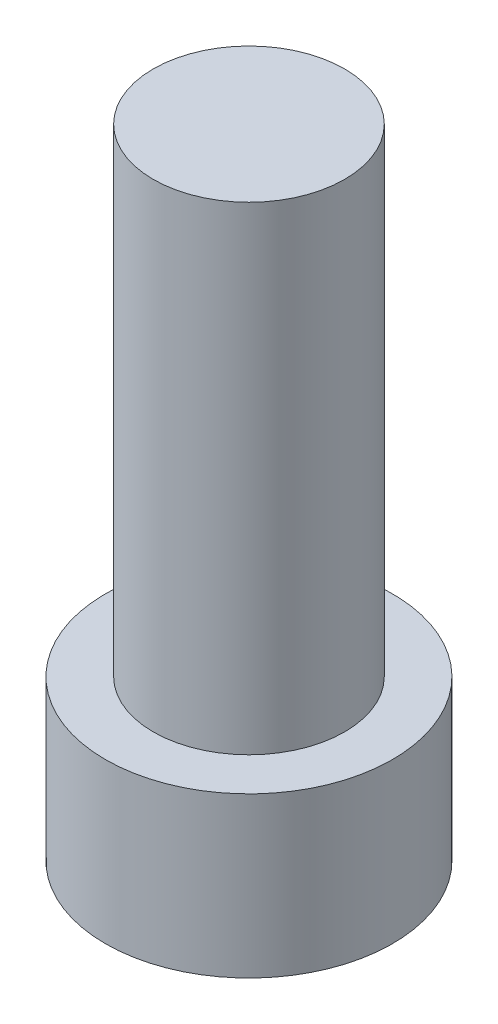
ISO-10303-21;
HEADER;
FILE_DESCRIPTION(('STEP AP214'),'2;1');
FILE_NAME('part.step','',(''),(''),'','','');
FILE_SCHEMA(('AUTOMOTIVE_DESIGN { 1 0 10303 214 1 1 1 1 }'));
ENDSEC;
DATA;
#1=APPLICATION_CONTEXT('core data for automotive mechanical design processes');
#2=APPLICATION_PROTOCOL_DEFINITION('international standard','automotive_design',2000,#1);
#3=PRODUCT_CONTEXT('',#1,'mechanical');
#4=PRODUCT('Part','Part','',(#3));
#5=PRODUCT_RELATED_PRODUCT_CATEGORY('part','',(#4));
#6=PRODUCT_DEFINITION_FORMATION('','',#4);
#7=PRODUCT_DEFINITION_CONTEXT('part definition',#1,'design');
#8=PRODUCT_DEFINITION('design','',#6,#7);
#9=PRODUCT_DEFINITION_SHAPE('','',#8);
#10=(LENGTH_UNIT() NAMED_UNIT(*) SI_UNIT(.MILLI.,.METRE.));
#11=(NAMED_UNIT(*) PLANE_ANGLE_UNIT() SI_UNIT($,.RADIAN.));
#12=(NAMED_UNIT(*) SI_UNIT($,.STERADIAN.) SOLID_ANGLE_UNIT());
#13=UNCERTAINTY_MEASURE_WITH_UNIT(LENGTH_MEASURE(1.E-05),#10,'distance_accuracy_value','');
#14=(GEOMETRIC_REPRESENTATION_CONTEXT(3) GLOBAL_UNCERTAINTY_ASSIGNED_CONTEXT((#13)) GLOBAL_UNIT_ASSIGNED_CONTEXT((#10,
#11,#12)) REPRESENTATION_CONTEXT('',''));
#15=CARTESIAN_POINT('',(0.,0.,0.));
#16=DIRECTION('',(0.,0.,1.));
#17=DIRECTION('',(1.,0.,0.));
#18=AXIS2_PLACEMENT_3D('',#15,#16,#17);
#19=CARTESIAN_POINT('',(0.,20.,0.));
#20=DIRECTION('',(0.,-1.,0.));
#21=DIRECTION('',(0.,0.,-1.));
#22=AXIS2_PLACEMENT_3D('',#19,#20,#21);
#23=CYLINDRICAL_SURFACE('',#22,4.5);
#24=CARTESIAN_POINT('',(0.,0.,0.));
#25=DIRECTION('',(0.,1.,0.));
#26=DIRECTION('',(0.,0.,1.));
#27=AXIS2_PLACEMENT_3D('',#24,#25,#26);
#28=CIRCLE('',#27,4.5);
#29=CARTESIAN_POINT('',(0.,0.,4.5));
#30=VERTEX_POINT('',#29);
#31=EDGE_CURVE('E10',#30,#30,#28,.T.);
#32=ORIENTED_EDGE('',*,*,#31,.T.);
#33=EDGE_LOOP('',(#32));
#34=FACE_BOUND('',#33,.T.);
#35=CARTESIAN_POINT('',(0.,5.,0.));
#36=DIRECTION('',(0.,1.,0.));
#37=DIRECTION('',(0.,0.,1.));
#38=AXIS2_PLACEMENT_3D('',#35,#36,#37);
#39=CIRCLE('',#38,4.5);
#40=CARTESIAN_POINT('',(0.,5.,4.5));
#41=VERTEX_POINT('',#40);
#42=EDGE_CURVE('E39',#41,#41,#39,.T.);
#43=ORIENTED_EDGE('',*,*,#42,.F.);
#44=EDGE_LOOP('',(#43));
#45=FACE_BOUND('',#44,.T.);
#46=ADVANCED_FACE('F33',(#34,#45),#23,.T.);
#47=CARTESIAN_POINT('',(0.,0.,0.));
#48=DIRECTION('',(0.,1.,0.));
#49=DIRECTION('',(0.,0.,1.));
#50=AXIS2_PLACEMENT_3D('',#47,#48,#49);
#51=PLANE('',#50);
#52=CARTESIAN_POINT('',(0.,0.,0.));
#53=DIRECTION('',(0.,-1.,0.));
#54=DIRECTION('',(0.,0.,-1.));
#55=AXIS2_PLACEMENT_3D('',#52,#53,#54);
#56=CIRCLE('',#55,1.5875);
#57=CARTESIAN_POINT('',(0.,0.,-1.5875));
#58=VERTEX_POINT('',#57);
#59=EDGE_CURVE('E53',#58,#58,#56,.T.);
#60=ORIENTED_EDGE('',*,*,#59,.F.);
#61=EDGE_LOOP('',(#60));
#62=FACE_BOUND('',#61,.T.);
#63=ORIENTED_EDGE('',*,*,#31,.F.);
#64=EDGE_LOOP('',(#63));
#65=FACE_BOUND('',#64,.T.);
#66=ADVANCED_FACE('F68',(#62,#65),#51,.F.);
#67=CARTESIAN_POINT('',(0.,5.,0.));
#68=DIRECTION('',(0.,1.,0.));
#69=DIRECTION('',(0.,0.,1.));
#70=AXIS2_PLACEMENT_3D('',#67,#68,#69);
#71=PLANE('',#70);
#72=CARTESIAN_POINT('',(0.,5.,0.));
#73=DIRECTION('',(0.,1.,0.));
#74=DIRECTION('',(0.,0.,1.));
#75=AXIS2_PLACEMENT_3D('',#72,#73,#74);
#76=CIRCLE('',#75,3.);
#77=CARTESIAN_POINT('',(0.,5.,3.));
#78=VERTEX_POINT('',#77);
#79=EDGE_CURVE('E43',#78,#78,#76,.T.);
#80=ORIENTED_EDGE('',*,*,#79,.F.);
#81=EDGE_LOOP('',(#80));
#82=FACE_BOUND('',#81,.T.);
#83=ORIENTED_EDGE('',*,*,#42,.T.);
#84=EDGE_LOOP('',(#83));
#85=FACE_BOUND('',#84,.T.);
#86=ADVANCED_FACE('F71',(#82,#85),#71,.T.);
#87=CARTESIAN_POINT('',(0.,5.,0.));
#88=DIRECTION('',(0.,1.,0.));
#89=DIRECTION('',(0.,0.,1.));
#90=AXIS2_PLACEMENT_3D('',#87,#88,#89);
#91=CYLINDRICAL_SURFACE('',#90,3.);
#92=ORIENTED_EDGE('',*,*,#79,.T.);
#93=EDGE_LOOP('',(#92));
#94=FACE_BOUND('',#93,.T.);
#95=CARTESIAN_POINT('',(0.,20.,0.));
#96=DIRECTION('',(0.,1.,0.));
#97=DIRECTION('',(0.,0.,1.));
#98=AXIS2_PLACEMENT_3D('',#95,#96,#97);
#99=CIRCLE('',#98,3.);
#100=CARTESIAN_POINT('',(0.,20.,3.));
#101=VERTEX_POINT('',#100);
#102=EDGE_CURVE('E47',#101,#101,#99,.T.);
#103=ORIENTED_EDGE('',*,*,#102,.F.);
#104=EDGE_LOOP('',(#103));
#105=FACE_BOUND('',#104,.T.);
#106=ADVANCED_FACE('F76',(#94,#105),#91,.T.);
#107=CARTESIAN_POINT('',(0.,20.,0.));
#108=DIRECTION('',(0.,1.,0.));
#109=DIRECTION('',(0.,0.,1.));
#110=AXIS2_PLACEMENT_3D('',#107,#108,#109);
#111=PLANE('',#110);
#112=ORIENTED_EDGE('',*,*,#102,.T.);
#113=EDGE_LOOP('',(#112));
#114=FACE_BOUND('',#113,.T.);
#115=ADVANCED_FACE('F64',(#114),#111,.T.);
#116=CARTESIAN_POINT('',(0.,15.,0.));
#117=DIRECTION('',(0.,-1.,0.));
#118=DIRECTION('',(0.,0.,-1.));
#119=AXIS2_PLACEMENT_3D('',#116,#117,#118);
#120=CYLINDRICAL_SURFACE('',#119,1.5875);
#121=CARTESIAN_POINT('',(0.,15.,0.));
#122=DIRECTION('',(0.,-1.,0.));
#123=DIRECTION('',(0.,0.,-1.));
#124=AXIS2_PLACEMENT_3D('',#121,#122,#123);
#125=CIRCLE('',#124,1.5875);
#126=CARTESIAN_POINT('',(0.,15.,-1.5875));
#127=VERTEX_POINT('',#126);
#128=EDGE_CURVE('E51',#127,#127,#125,.T.);
#129=ORIENTED_EDGE('',*,*,#128,.F.);
#130=EDGE_LOOP('',(#129));
#131=FACE_BOUND('',#130,.T.);
#132=ORIENTED_EDGE('',*,*,#59,.T.);
#133=EDGE_LOOP('',(#132));
#134=FACE_BOUND('',#133,.T.);
#135=ADVANCED_FACE('F61',(#131,#134),#120,.F.);
#136=CARTESIAN_POINT('',(0.,15.,0.));
#137=DIRECTION('',(0.,-1.,0.));
#138=DIRECTION('',(0.,0.,-1.));
#139=AXIS2_PLACEMENT_3D('',#136,#137,#138);
#140=PLANE('',#139);
#141=ORIENTED_EDGE('',*,*,#128,.T.);
#142=EDGE_LOOP('',(#141));
#143=FACE_BOUND('',#142,.T.);
#144=ADVANCED_FACE('F59',(#143),#140,.T.);
#145=CLOSED_SHELL('',(#46,#66,#86,#106,#115,#135,#144));
#146=MANIFOLD_SOLID_BREP('B2',#145);
#147=ADVANCED_BREP_SHAPE_REPRESENTATION('',(#18,#146),#14);
#148=SHAPE_DEFINITION_REPRESENTATION(#9,#147);
ENDSEC;
END-ISO-10303-21;
